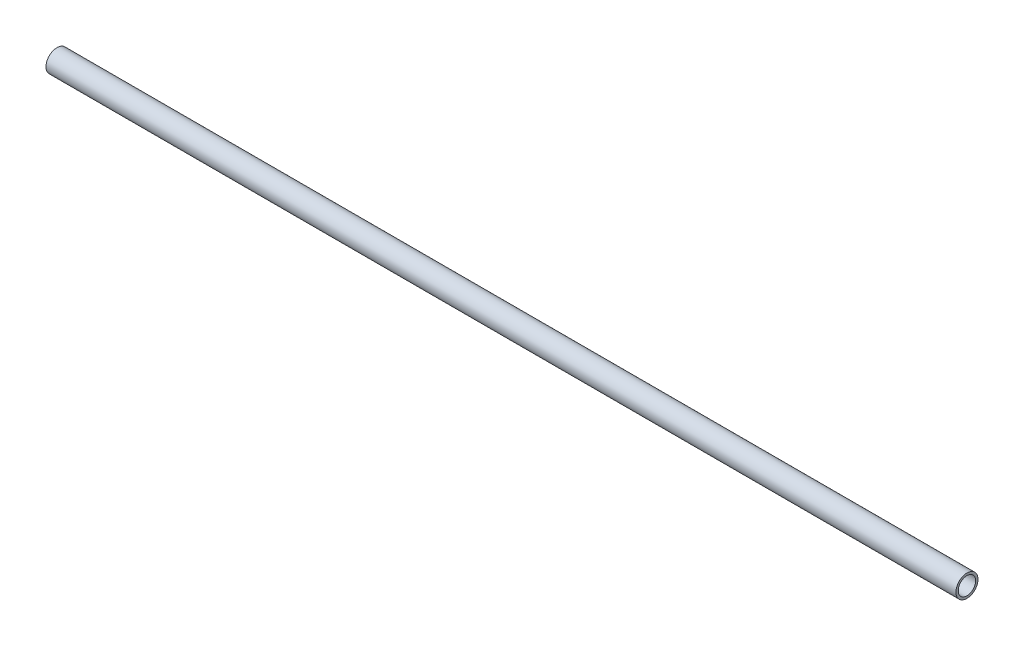
ISO-10303-21;
HEADER;
FILE_DESCRIPTION(('STEP AP214'),'2;1');
FILE_NAME('part.step','',(''),(''),'','','');
FILE_SCHEMA(('AUTOMOTIVE_DESIGN { 1 0 10303 214 1 1 1 1 }'));
ENDSEC;
DATA;
#1=APPLICATION_CONTEXT('core data for automotive mechanical design processes');
#2=APPLICATION_PROTOCOL_DEFINITION('international standard','automotive_design',2000,#1);
#3=PRODUCT_CONTEXT('',#1,'mechanical');
#4=PRODUCT('Part','Part','',(#3));
#5=PRODUCT_RELATED_PRODUCT_CATEGORY('part','',(#4));
#6=PRODUCT_DEFINITION_FORMATION('','',#4);
#7=PRODUCT_DEFINITION_CONTEXT('part definition',#1,'design');
#8=PRODUCT_DEFINITION('design','',#6,#7);
#9=PRODUCT_DEFINITION_SHAPE('','',#8);
#10=(LENGTH_UNIT() NAMED_UNIT(*) SI_UNIT(.MILLI.,.METRE.));
#11=(NAMED_UNIT(*) PLANE_ANGLE_UNIT() SI_UNIT($,.RADIAN.));
#12=(NAMED_UNIT(*) SI_UNIT($,.STERADIAN.) SOLID_ANGLE_UNIT());
#13=UNCERTAINTY_MEASURE_WITH_UNIT(LENGTH_MEASURE(1.E-05),#10,'distance_accuracy_value','');
#14=(GEOMETRIC_REPRESENTATION_CONTEXT(3) GLOBAL_UNCERTAINTY_ASSIGNED_CONTEXT((#13)) GLOBAL_UNIT_ASSIGNED_CONTEXT((#10,
#11,#12)) REPRESENTATION_CONTEXT('',''));
#15=CARTESIAN_POINT('',(0.,0.,0.));
#16=DIRECTION('',(0.,0.,1.));
#17=DIRECTION('',(1.,0.,0.));
#18=AXIS2_PLACEMENT_3D('',#15,#16,#17);
#19=CARTESIAN_POINT('',(1565.549,0.,0.));
#20=DIRECTION('',(1.,0.,0.));
#21=DIRECTION('',(0.,0.,-1.));
#22=AXIS2_PLACEMENT_3D('',#19,#20,#21);
#23=PLANE('',#22);
#24=CARTESIAN_POINT('',(1565.549,0.,0.));
#25=DIRECTION('',(1.,0.,0.));
#26=DIRECTION('',(0.,0.,-1.));
#27=AXIS2_PLACEMENT_3D('',#24,#25,#26);
#28=CIRCLE('',#27,19.);
#29=CARTESIAN_POINT('',(1565.549,0.,-19.));
#30=VERTEX_POINT('',#29);
#31=EDGE_CURVE('E10',#30,#30,#28,.T.);
#32=ORIENTED_EDGE('',*,*,#31,.T.);
#33=EDGE_LOOP('',(#32));
#34=FACE_BOUND('',#33,.T.);
#35=CARTESIAN_POINT('',(1565.549,0.,0.));
#36=DIRECTION('',(1.,0.,0.));
#37=DIRECTION('',(0.,0.,-1.));
#38=AXIS2_PLACEMENT_3D('',#35,#36,#37);
#39=CIRCLE('',#38,15.);
#40=CARTESIAN_POINT('',(1565.549,0.,-15.));
#41=VERTEX_POINT('',#40);
#42=EDGE_CURVE('E42',#41,#41,#39,.T.);
#43=ORIENTED_EDGE('',*,*,#42,.F.);
#44=EDGE_LOOP('',(#43));
#45=FACE_BOUND('',#44,.T.);
#46=ADVANCED_FACE('F31',(#34,#45),#23,.T.);
#47=CARTESIAN_POINT('',(0.,0.,0.));
#48=DIRECTION('',(1.,0.,0.));
#49=DIRECTION('',(0.,0.,-1.));
#50=AXIS2_PLACEMENT_3D('',#47,#48,#49);
#51=PLANE('',#50);
#52=CARTESIAN_POINT('',(0.,0.,0.));
#53=DIRECTION('',(1.,0.,0.));
#54=DIRECTION('',(0.,0.,-1.));
#55=AXIS2_PLACEMENT_3D('',#52,#53,#54);
#56=CIRCLE('',#55,19.);
#57=CARTESIAN_POINT('',(0.,0.,-19.));
#58=VERTEX_POINT('',#57);
#59=EDGE_CURVE('E35',#58,#58,#56,.T.);
#60=ORIENTED_EDGE('',*,*,#59,.F.);
#61=EDGE_LOOP('',(#60));
#62=FACE_BOUND('',#61,.T.);
#63=CARTESIAN_POINT('',(0.,0.,0.));
#64=DIRECTION('',(1.,0.,0.));
#65=DIRECTION('',(0.,0.,-1.));
#66=AXIS2_PLACEMENT_3D('',#63,#64,#65);
#67=CIRCLE('',#66,15.);
#68=CARTESIAN_POINT('',(0.,0.,-15.));
#69=VERTEX_POINT('',#68);
#70=EDGE_CURVE('E44',#69,#69,#67,.T.);
#71=ORIENTED_EDGE('',*,*,#70,.T.);
#72=EDGE_LOOP('',(#71));
#73=FACE_BOUND('',#72,.T.);
#74=ADVANCED_FACE('F54',(#62,#73),#51,.F.);
#75=CARTESIAN_POINT('',(1565.549,0.,0.));
#76=DIRECTION('',(-1.,0.,0.));
#77=DIRECTION('',(0.,0.,1.));
#78=AXIS2_PLACEMENT_3D('',#75,#76,#77);
#79=CYLINDRICAL_SURFACE('',#78,19.);
#80=ORIENTED_EDGE('',*,*,#31,.F.);
#81=EDGE_LOOP('',(#80));
#82=FACE_BOUND('',#81,.T.);
#83=ORIENTED_EDGE('',*,*,#59,.T.);
#84=EDGE_LOOP('',(#83));
#85=FACE_BOUND('',#84,.T.);
#86=ADVANCED_FACE('F33',(#82,#85),#79,.T.);
#87=CARTESIAN_POINT('',(1565.549,0.,0.));
#88=DIRECTION('',(-1.,0.,0.));
#89=DIRECTION('',(0.,0.,1.));
#90=AXIS2_PLACEMENT_3D('',#87,#88,#89);
#91=CYLINDRICAL_SURFACE('',#90,15.);
#92=ORIENTED_EDGE('',*,*,#42,.T.);
#93=EDGE_LOOP('',(#92));
#94=FACE_BOUND('',#93,.T.);
#95=ORIENTED_EDGE('',*,*,#70,.F.);
#96=EDGE_LOOP('',(#95));
#97=FACE_BOUND('',#96,.T.);
#98=ADVANCED_FACE('F50',(#94,#97),#91,.F.);
#99=CLOSED_SHELL('',(#46,#74,#86,#98));
#100=MANIFOLD_SOLID_BREP('B2',#99);
#101=ADVANCED_BREP_SHAPE_REPRESENTATION('',(#18,#100),#14);
#102=SHAPE_DEFINITION_REPRESENTATION(#9,#101);
ENDSEC;
END-ISO-10303-21;
